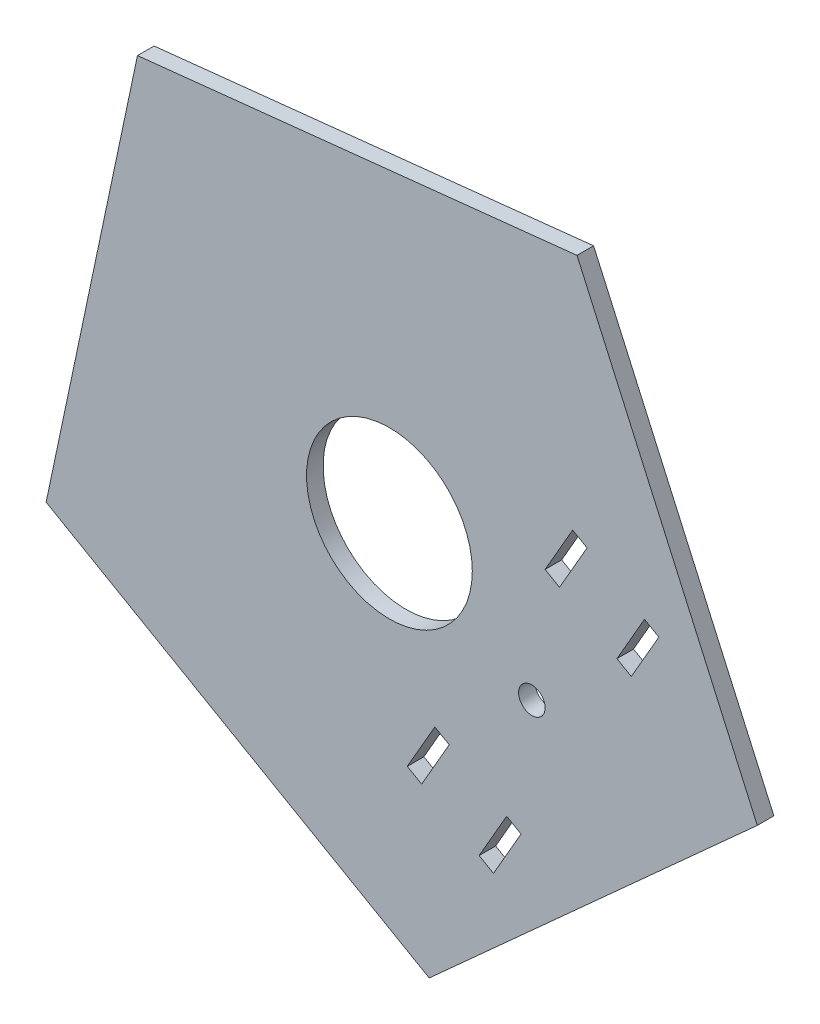
ISO-10303-21;
HEADER;
FILE_DESCRIPTION(('STEP AP214'),'2;1');
FILE_NAME('part.step','',(''),(''),'','','');
FILE_SCHEMA(('AUTOMOTIVE_DESIGN { 1 0 10303 214 1 1 1 1 }'));
ENDSEC;
DATA;
#1=APPLICATION_CONTEXT('core data for automotive mechanical design processes');
#2=APPLICATION_PROTOCOL_DEFINITION('international standard','automotive_design',2000,#1);
#3=PRODUCT_CONTEXT('',#1,'mechanical');
#4=PRODUCT('Part','Part','',(#3));
#5=PRODUCT_RELATED_PRODUCT_CATEGORY('part','',(#4));
#6=PRODUCT_DEFINITION_FORMATION('','',#4);
#7=PRODUCT_DEFINITION_CONTEXT('part definition',#1,'design');
#8=PRODUCT_DEFINITION('design','',#6,#7);
#9=PRODUCT_DEFINITION_SHAPE('','',#8);
#10=(LENGTH_UNIT() NAMED_UNIT(*) SI_UNIT(.MILLI.,.METRE.));
#11=(NAMED_UNIT(*) PLANE_ANGLE_UNIT() SI_UNIT($,.RADIAN.));
#12=(NAMED_UNIT(*) SI_UNIT($,.STERADIAN.) SOLID_ANGLE_UNIT());
#13=UNCERTAINTY_MEASURE_WITH_UNIT(LENGTH_MEASURE(1.E-05),#10,'distance_accuracy_value','');
#14=(GEOMETRIC_REPRESENTATION_CONTEXT(3) GLOBAL_UNCERTAINTY_ASSIGNED_CONTEXT((#13)) GLOBAL_UNIT_ASSIGNED_CONTEXT((#10,
#11,#12)) REPRESENTATION_CONTEXT('',''));
#15=CARTESIAN_POINT('',(0.,0.,0.));
#16=DIRECTION('',(0.,0.,1.));
#17=DIRECTION('',(1.,0.,0.));
#18=AXIS2_PLACEMENT_3D('',#15,#16,#17);
#19=CARTESIAN_POINT('',(0.,0.,3.));
#20=DIRECTION('',(0.,0.,1.));
#21=DIRECTION('',(1.,0.,0.));
#22=AXIS2_PLACEMENT_3D('',#19,#20,#21);
#23=PLANE('',#22);
#24=CARTESIAN_POINT('',(25.7831269704512,-14.8422661216403,3.));
#25=DIRECTION('',(0.,0.,-1.));
#26=DIRECTION('',(-1.,0.,0.));
#27=AXIS2_PLACEMENT_3D('',#24,#25,#26);
#28=CIRCLE('',#27,2.4);
#29=CARTESIAN_POINT('',(23.3831269704512,-14.8422661216403,3.));
#30=VERTEX_POINT('',#29);
#31=EDGE_CURVE('E602',#30,#30,#28,.T.);
#32=ORIENTED_EDGE('',*,*,#31,.T.);
#33=EDGE_LOOP('',(#32));
#34=FACE_BOUND('',#33,.T.);
#35=DIRECTION('',(-0.8666597300992,0.498899701567742,0.));
#36=VECTOR('',#35,1.);
#37=CARTESIAN_POINT('',(10.821839491026,-29.3067874396098,3.));
#38=LINE('',#37,#36);
#39=CARTESIAN_POINT('',(10.821839491026,-29.3067874396098,3.));
#40=VERTEX_POINT('',#39);
#41=CARTESIAN_POINT('',(8.22186030072837,-27.8100883349066,3.));
#42=VERTEX_POINT('',#41);
#43=EDGE_CURVE('E58',#40,#42,#38,.T.);
#44=ORIENTED_EDGE('',*,*,#43,.F.);
#45=DIRECTION('',(-0.498899701567742,-0.8666597300992,0.));
#46=VECTOR('',#45,1.);
#47=CARTESIAN_POINT('',(10.821839491026,-29.3067874396098,3.));
#48=LINE('',#47,#46);
#49=CARTESIAN_POINT('',(5.83284247534856,-37.9733847406018,3.));
#50=VERTEX_POINT('',#49);
#51=EDGE_CURVE('E254',#40,#50,#48,.T.);
#52=ORIENTED_EDGE('',*,*,#51,.T.);
#53=DIRECTION('',(-0.8666597300992,0.498899701567741,0.));
#54=VECTOR('',#53,1.);
#55=CARTESIAN_POINT('',(5.83284247534856,-37.9733847406018,3.));
#56=LINE('',#55,#54);
#57=CARTESIAN_POINT('',(3.23286328505096,-36.4766856358986,3.));
#58=VERTEX_POINT('',#57);
#59=EDGE_CURVE('E257',#50,#58,#56,.T.);
#60=ORIENTED_EDGE('',*,*,#59,.T.);
#61=DIRECTION('',(-0.498899701567741,-0.8666597300992,0.));
#62=VECTOR('',#61,1.);
#63=CARTESIAN_POINT('',(8.22186030072838,-27.8100883349066,3.));
#64=LINE('',#63,#62);
#65=EDGE_CURVE('E261',#42,#58,#64,.T.);
#66=ORIENTED_EDGE('',*,*,#65,.F.);
#67=EDGE_LOOP('',(#44,#52,#60,#66));
#68=FACE_BOUND('',#67,.T.);
#69=CARTESIAN_POINT('',(0.,0.,3.));
#70=DIRECTION('',(0.,0.,1.));
#71=DIRECTION('',(1.,0.,0.));
#72=AXIS2_PLACEMENT_3D('',#69,#70,#71);
#73=CIRCLE('',#72,15.);
#74=CARTESIAN_POINT('',(15.,0.,3.));
#75=VERTEX_POINT('',#74);
#76=EDGE_CURVE('E298',#75,#75,#73,.T.);
#77=ORIENTED_EDGE('',*,*,#76,.F.);
#78=EDGE_LOOP('',(#77));
#79=FACE_BOUND('',#78,.T.);
#80=DIRECTION('',(-0.407896563036024,0.913028145164977,0.));
#81=VECTOR('',#80,1.);
#82=CARTESIAN_POINT('',(66.5828797968972,-14.0642676151945,3.));
#83=LINE('',#82,#81);
#84=CARTESIAN_POINT('',(66.5828797968972,-14.0642676151945,3.));
#85=VERTEX_POINT('',#84);
#86=CARTESIAN_POINT('',(33.9511547540153,58.9779839980037,3.));
#87=VERTEX_POINT('',#86);
#88=EDGE_CURVE('E311',#85,#87,#83,.T.);
#89=ORIENTED_EDGE('',*,*,#88,.T.);
#90=DIRECTION('',(-0.994388336945293,-0.105791471051193,0.));
#91=VECTOR('',#90,1.);
#92=CARTESIAN_POINT('',(33.9511547540153,58.9779839980037,3.));
#93=LINE('',#92,#91);
#94=CARTESIAN_POINT('',(-45.5999122016082,50.5146663139082,3.));
#95=VERTEX_POINT('',#94);
#96=EDGE_CURVE('E314',#87,#95,#93,.T.);
#97=ORIENTED_EDGE('',*,*,#96,.T.);
#98=DIRECTION('',(-0.20666922721265,-0.978410869994465,0.));
#99=VECTOR('',#98,1.);
#100=CARTESIAN_POINT('',(-45.5999122016082,50.5146663139082,3.));
#101=LINE('',#100,#99);
#102=CARTESIAN_POINT('',(-62.1334503786201,-27.758203285649,3.));
#103=VERTEX_POINT('',#102);
#104=EDGE_CURVE('E317',#95,#103,#101,.T.);
#105=ORIENTED_EDGE('',*,*,#104,.T.);
#106=DIRECTION('',(0.8666597300992,-0.498899701567741,0.));
#107=VECTOR('',#106,1.);
#108=CARTESIAN_POINT('',(-62.1334503786201,-27.758203285649,3.));
#109=LINE('',#108,#107);
#110=CARTESIAN_POINT('',(7.19932802931592,-67.6701794110683,3.));
#111=VERTEX_POINT('',#110);
#112=EDGE_CURVE('E319',#103,#111,#109,.T.);
#113=ORIENTED_EDGE('',*,*,#112,.T.);
#114=DIRECTION('',(0.742294397094766,0.670073897448422,0.));
#115=VECTOR('',#114,1.);
#116=CARTESIAN_POINT('',(7.19932802931592,-67.6701794110683,3.));
#117=LINE('',#116,#115);
#118=EDGE_CURVE('E321',#111,#85,#117,.T.);
#119=ORIENTED_EDGE('',*,*,#118,.T.);
#120=EDGE_LOOP('',(#89,#97,#105,#113,#119));
#121=FACE_BOUND('',#120,.T.);
#122=DIRECTION('',(-0.866659730099201,0.49889970156774,0.));
#123=VECTOR('',#122,1.);
#124=CARTESIAN_POINT('',(9.97799403135477,17.333194601984,3.));
#125=LINE('',#124,#123);
#126=CARTESIAN_POINT('',(30.7778275537356,5.35960176435822,3.));
#127=VERTEX_POINT('',#126);
#128=CARTESIAN_POINT('',(28.177848363438,6.85630086906145,3.));
#129=VERTEX_POINT('',#128);
#130=EDGE_CURVE('E288',#127,#129,#125,.T.);
#131=ORIENTED_EDGE('',*,*,#130,.T.);
#132=DIRECTION('',(0.498899701567744,0.866659730099199,0.));
#133=VECTOR('',#132,1.);
#134=CARTESIAN_POINT('',(18.1998543320831,-10.4768937329226,3.));
#135=LINE('',#134,#133);
#136=CARTESIAN_POINT('',(33.1668453791155,15.5228981700534,3.));
#137=VERTEX_POINT('',#136);
#138=EDGE_CURVE('E237',#129,#137,#135,.T.);
#139=ORIENTED_EDGE('',*,*,#138,.T.);
#140=DIRECTION('',(-0.866659730099201,0.498899701567739,0.));
#141=VECTOR('',#140,1.);
#142=CARTESIAN_POINT('',(14.9669910470322,25.999791902976,3.));
#143=LINE('',#142,#141);
#144=CARTESIAN_POINT('',(35.7668245694131,14.0261990653502,3.));
#145=VERTEX_POINT('',#144);
#146=EDGE_CURVE('E277',#145,#137,#143,.T.);
#147=ORIENTED_EDGE('',*,*,#146,.F.);
#148=DIRECTION('',(0.498899701567743,0.866659730099199,0.));
#149=VECTOR('',#148,1.);
#150=CARTESIAN_POINT('',(20.7998335223807,-11.9735928376258,3.));
#151=LINE('',#150,#149);
#152=EDGE_CURVE('E291',#127,#145,#151,.T.);
#153=ORIENTED_EDGE('',*,*,#152,.F.);
#154=EDGE_LOOP('',(#131,#139,#147,#153));
#155=FACE_BOUND('',#154,.T.);
#156=DIRECTION('',(-0.498899701567742,-0.8666597300992,0.));
#157=VECTOR('',#156,1.);
#158=CARTESIAN_POINT('',(21.2217562522164,-35.2935838584227,3.));
#159=LINE('',#158,#157);
#160=CARTESIAN_POINT('',(21.2217562522164,-35.2935838584227,3.));
#161=VERTEX_POINT('',#160);
#162=CARTESIAN_POINT('',(16.232759236539,-43.9601811594147,3.));
#163=VERTEX_POINT('',#162);
#164=EDGE_CURVE('E196',#161,#163,#159,.T.);
#165=ORIENTED_EDGE('',*,*,#164,.F.);
#166=DIRECTION('',(0.8666597300992,-0.498899701567742,0.));
#167=VECTOR('',#166,1.);
#168=CARTESIAN_POINT('',(21.2217562522164,-35.2935838584227,3.));
#169=LINE('',#168,#167);
#170=CARTESIAN_POINT('',(23.821735442514,-36.7902829631259,3.));
#171=VERTEX_POINT('',#170);
#172=EDGE_CURVE('E205',#161,#171,#169,.T.);
#173=ORIENTED_EDGE('',*,*,#172,.T.);
#174=DIRECTION('',(-0.498899701567742,-0.8666597300992,0.));
#175=VECTOR('',#174,1.);
#176=CARTESIAN_POINT('',(23.821735442514,-36.7902829631259,3.));
#177=LINE('',#176,#175);
#178=CARTESIAN_POINT('',(18.8327384268366,-45.4568802641179,3.));
#179=VERTEX_POINT('',#178);
#180=EDGE_CURVE('E203',#171,#179,#177,.T.);
#181=ORIENTED_EDGE('',*,*,#180,.T.);
#182=DIRECTION('',(0.8666597300992,-0.498899701567742,0.));
#183=VECTOR('',#182,1.);
#184=CARTESIAN_POINT('',(16.232759236539,-43.9601811594147,3.));
#185=LINE('',#184,#183);
#186=EDGE_CURVE('E184',#163,#179,#185,.T.);
#187=ORIENTED_EDGE('',*,*,#186,.F.);
#188=EDGE_LOOP('',(#165,#173,#181,#187));
#189=FACE_BOUND('',#188,.T.);
#190=DIRECTION('',(0.866659730099199,-0.498899701567744,0.));
#191=VECTOR('',#190,1.);
#192=CARTESIAN_POINT('',(9.97799403135491,17.3331946019841,3.));
#193=LINE('',#192,#191);
#194=CARTESIAN_POINT('',(41.1777443149261,-0.6271946544547,3.));
#195=VERTEX_POINT('',#194);
#196=CARTESIAN_POINT('',(43.7777235052237,-2.12389375915793,3.));
#197=VERTEX_POINT('',#196);
#198=EDGE_CURVE('E233',#195,#197,#193,.T.);
#199=ORIENTED_EDGE('',*,*,#198,.F.);
#200=DIRECTION('',(0.49889970156774,0.866659730099201,0.));
#201=VECTOR('',#200,1.);
#202=CARTESIAN_POINT('',(31.1997502835713,-17.9603892564387,3.));
#203=LINE('',#202,#201);
#204=CARTESIAN_POINT('',(46.1667413306035,8.03940264653732,3.));
#205=VERTEX_POINT('',#204);
#206=EDGE_CURVE('E50',#195,#205,#203,.T.);
#207=ORIENTED_EDGE('',*,*,#206,.T.);
#208=DIRECTION('',(0.866659730099199,-0.498899701567743,0.));
#209=VECTOR('',#208,1.);
#210=CARTESIAN_POINT('',(14.9669910470323,25.999791902976,3.));
#211=LINE('',#210,#209);
#212=CARTESIAN_POINT('',(48.7667205209011,6.54270354183408,3.));
#213=VERTEX_POINT('',#212);
#214=EDGE_CURVE('E226',#205,#213,#211,.T.);
#215=ORIENTED_EDGE('',*,*,#214,.T.);
#216=DIRECTION('',(0.49889970156774,0.866659730099201,0.));
#217=VECTOR('',#216,1.);
#218=CARTESIAN_POINT('',(33.7997294738689,-19.4570883611419,3.));
#219=LINE('',#218,#217);
#220=EDGE_CURVE('E229',#197,#213,#219,.T.);
#221=ORIENTED_EDGE('',*,*,#220,.F.);
#222=EDGE_LOOP('',(#199,#207,#215,#221));
#223=FACE_BOUND('',#222,.T.);
#224=ADVANCED_FACE('F35',(#34,#68,#79,#121,#155,#189,#223),#23,.T.);
#225=CARTESIAN_POINT('',(0.,0.,0.));
#226=DIRECTION('',(0.,0.,1.));
#227=DIRECTION('',(1.,0.,0.));
#228=AXIS2_PLACEMENT_3D('',#225,#226,#227);
#229=PLANE('',#228);
#230=CARTESIAN_POINT('',(25.7831269704512,-14.8422661216403,0.));
#231=DIRECTION('',(0.,0.,-1.));
#232=DIRECTION('',(-1.,0.,0.));
#233=AXIS2_PLACEMENT_3D('',#230,#231,#232);
#234=CIRCLE('',#233,2.4);
#235=CARTESIAN_POINT('',(23.3831269704512,-14.8422661216403,0.));
#236=VERTEX_POINT('',#235);
#237=EDGE_CURVE('E605',#236,#236,#234,.T.);
#238=ORIENTED_EDGE('',*,*,#237,.F.);
#239=EDGE_LOOP('',(#238));
#240=FACE_BOUND('',#239,.T.);
#241=DIRECTION('',(0.8666597300992,-0.498899701567742,0.));
#242=VECTOR('',#241,1.);
#243=CARTESIAN_POINT('',(21.2217562522164,-35.2935838584227,0.));
#244=LINE('',#243,#242);
#245=CARTESIAN_POINT('',(21.2217562522164,-35.2935838584227,0.));
#246=VERTEX_POINT('',#245);
#247=CARTESIAN_POINT('',(23.821735442514,-36.7902829631259,0.));
#248=VERTEX_POINT('',#247);
#249=EDGE_CURVE('E200',#246,#248,#244,.T.);
#250=ORIENTED_EDGE('',*,*,#249,.F.);
#251=DIRECTION('',(-0.498899701567742,-0.8666597300992,0.));
#252=VECTOR('',#251,1.);
#253=CARTESIAN_POINT('',(21.2217562522164,-35.2935838584227,0.));
#254=LINE('',#253,#252);
#255=CARTESIAN_POINT('',(16.232759236539,-43.9601811594147,0.));
#256=VERTEX_POINT('',#255);
#257=EDGE_CURVE('E211',#246,#256,#254,.T.);
#258=ORIENTED_EDGE('',*,*,#257,.T.);
#259=DIRECTION('',(0.8666597300992,-0.498899701567742,0.));
#260=VECTOR('',#259,1.);
#261=CARTESIAN_POINT('',(16.232759236539,-43.9601811594147,0.));
#262=LINE('',#261,#260);
#263=CARTESIAN_POINT('',(18.8327384268366,-45.4568802641179,0.));
#264=VERTEX_POINT('',#263);
#265=EDGE_CURVE('E187',#256,#264,#262,.T.);
#266=ORIENTED_EDGE('',*,*,#265,.T.);
#267=DIRECTION('',(-0.498899701567742,-0.8666597300992,0.));
#268=VECTOR('',#267,1.);
#269=CARTESIAN_POINT('',(23.821735442514,-36.7902829631259,0.));
#270=LINE('',#269,#268);
#271=EDGE_CURVE('E214',#248,#264,#270,.T.);
#272=ORIENTED_EDGE('',*,*,#271,.F.);
#273=EDGE_LOOP('',(#250,#258,#266,#272));
#274=FACE_BOUND('',#273,.T.);
#275=DIRECTION('',(-0.407896563036024,0.913028145164977,0.));
#276=VECTOR('',#275,1.);
#277=CARTESIAN_POINT('',(66.5828797968972,-14.0642676151945,0.));
#278=LINE('',#277,#276);
#279=CARTESIAN_POINT('',(66.5828797968972,-14.0642676151945,0.));
#280=VERTEX_POINT('',#279);
#281=CARTESIAN_POINT('',(33.9511547540153,58.9779839980037,0.));
#282=VERTEX_POINT('',#281);
#283=EDGE_CURVE('E308',#280,#282,#278,.T.);
#284=ORIENTED_EDGE('',*,*,#283,.F.);
#285=DIRECTION('',(0.742294397094766,0.670073897448422,0.));
#286=VECTOR('',#285,1.);
#287=CARTESIAN_POINT('',(7.19932802931592,-67.6701794110683,0.));
#288=LINE('',#287,#286);
#289=CARTESIAN_POINT('',(7.19932802931592,-67.6701794110683,0.));
#290=VERTEX_POINT('',#289);
#291=EDGE_CURVE('E315',#290,#280,#288,.T.);
#292=ORIENTED_EDGE('',*,*,#291,.F.);
#293=DIRECTION('',(0.8666597300992,-0.498899701567741,0.));
#294=VECTOR('',#293,1.);
#295=CARTESIAN_POINT('',(-62.1334503786201,-27.758203285649,0.));
#296=LINE('',#295,#294);
#297=CARTESIAN_POINT('',(-62.1334503786201,-27.758203285649,0.));
#298=VERTEX_POINT('',#297);
#299=EDGE_CURVE('E330',#298,#290,#296,.T.);
#300=ORIENTED_EDGE('',*,*,#299,.F.);
#301=DIRECTION('',(-0.20666922721265,-0.978410869994465,0.));
#302=VECTOR('',#301,1.);
#303=CARTESIAN_POINT('',(-45.5999122016082,50.5146663139082,0.));
#304=LINE('',#303,#302);
#305=CARTESIAN_POINT('',(-45.5999122016082,50.5146663139082,0.));
#306=VERTEX_POINT('',#305);
#307=EDGE_CURVE('E328',#306,#298,#304,.T.);
#308=ORIENTED_EDGE('',*,*,#307,.F.);
#309=DIRECTION('',(-0.994388336945293,-0.105791471051193,0.));
#310=VECTOR('',#309,1.);
#311=CARTESIAN_POINT('',(33.9511547540153,58.9779839980037,0.));
#312=LINE('',#311,#310);
#313=EDGE_CURVE('E326',#282,#306,#312,.T.);
#314=ORIENTED_EDGE('',*,*,#313,.F.);
#315=EDGE_LOOP('',(#284,#292,#300,#308,#314));
#316=FACE_BOUND('',#315,.T.);
#317=CARTESIAN_POINT('',(0.,0.,0.));
#318=DIRECTION('',(0.,0.,1.));
#319=DIRECTION('',(1.,0.,0.));
#320=AXIS2_PLACEMENT_3D('',#317,#318,#319);
#321=CIRCLE('',#320,15.);
#322=CARTESIAN_POINT('',(15.,0.,0.));
#323=VERTEX_POINT('',#322);
#324=EDGE_CURVE('E305',#323,#323,#321,.T.);
#325=ORIENTED_EDGE('',*,*,#324,.T.);
#326=EDGE_LOOP('',(#325));
#327=FACE_BOUND('',#326,.T.);
#328=DIRECTION('',(0.498899701567744,0.866659730099199,0.));
#329=VECTOR('',#328,1.);
#330=CARTESIAN_POINT('',(18.1998543320831,-10.4768937329226,0.));
#331=LINE('',#330,#329);
#332=CARTESIAN_POINT('',(28.177848363438,6.85630086906145,0.));
#333=VERTEX_POINT('',#332);
#334=CARTESIAN_POINT('',(33.1668453791155,15.5228981700534,0.));
#335=VERTEX_POINT('',#334);
#336=EDGE_CURVE('E274',#333,#335,#331,.T.);
#337=ORIENTED_EDGE('',*,*,#336,.F.);
#338=DIRECTION('',(-0.866659730099201,0.49889970156774,0.));
#339=VECTOR('',#338,1.);
#340=CARTESIAN_POINT('',(9.97799403135477,17.333194601984,0.));
#341=LINE('',#340,#339);
#342=CARTESIAN_POINT('',(30.7778275537356,5.35960176435823,0.));
#343=VERTEX_POINT('',#342);
#344=EDGE_CURVE('E276',#343,#333,#341,.T.);
#345=ORIENTED_EDGE('',*,*,#344,.F.);
#346=DIRECTION('',(0.498899701567743,0.866659730099199,0.));
#347=VECTOR('',#346,1.);
#348=CARTESIAN_POINT('',(20.7998335223807,-11.9735928376258,0.));
#349=LINE('',#348,#347);
#350=CARTESIAN_POINT('',(35.7668245694131,14.0261990653502,0.));
#351=VERTEX_POINT('',#350);
#352=EDGE_CURVE('E279',#343,#351,#349,.T.);
#353=ORIENTED_EDGE('',*,*,#352,.T.);
#354=DIRECTION('',(-0.866659730099201,0.498899701567739,0.));
#355=VECTOR('',#354,1.);
#356=CARTESIAN_POINT('',(14.9669910470322,25.999791902976,0.));
#357=LINE('',#356,#355);
#358=EDGE_CURVE('E282',#351,#335,#357,.T.);
#359=ORIENTED_EDGE('',*,*,#358,.T.);
#360=EDGE_LOOP('',(#337,#345,#353,#359));
#361=FACE_BOUND('',#360,.T.);
#362=DIRECTION('',(-0.498899701567742,-0.8666597300992,0.));
#363=VECTOR('',#362,1.);
#364=CARTESIAN_POINT('',(10.821839491026,-29.3067874396098,0.));
#365=LINE('',#364,#363);
#366=CARTESIAN_POINT('',(10.821839491026,-29.3067874396098,0.));
#367=VERTEX_POINT('',#366);
#368=CARTESIAN_POINT('',(5.83284247534856,-37.9733847406018,0.));
#369=VERTEX_POINT('',#368);
#370=EDGE_CURVE('E248',#367,#369,#365,.T.);
#371=ORIENTED_EDGE('',*,*,#370,.F.);
#372=DIRECTION('',(-0.8666597300992,0.498899701567742,0.));
#373=VECTOR('',#372,1.);
#374=CARTESIAN_POINT('',(10.821839491026,-29.3067874396098,0.));
#375=LINE('',#374,#373);
#376=CARTESIAN_POINT('',(8.22186030072838,-27.8100883349066,0.));
#377=VERTEX_POINT('',#376);
#378=EDGE_CURVE('E258',#367,#377,#375,.T.);
#379=ORIENTED_EDGE('',*,*,#378,.T.);
#380=DIRECTION('',(-0.498899701567741,-0.8666597300992,0.));
#381=VECTOR('',#380,1.);
#382=CARTESIAN_POINT('',(8.22186030072838,-27.8100883349066,0.));
#383=LINE('',#382,#381);
#384=CARTESIAN_POINT('',(3.23286328505096,-36.4766856358986,0.));
#385=VERTEX_POINT('',#384);
#386=EDGE_CURVE('E269',#377,#385,#383,.T.);
#387=ORIENTED_EDGE('',*,*,#386,.T.);
#388=DIRECTION('',(-0.8666597300992,0.498899701567741,0.));
#389=VECTOR('',#388,1.);
#390=CARTESIAN_POINT('',(5.83284247534856,-37.9733847406018,0.));
#391=LINE('',#390,#389);
#392=EDGE_CURVE('E266',#369,#385,#391,.T.);
#393=ORIENTED_EDGE('',*,*,#392,.F.);
#394=EDGE_LOOP('',(#371,#379,#387,#393));
#395=FACE_BOUND('',#394,.T.);
#396=DIRECTION('',(0.49889970156774,0.866659730099201,0.));
#397=VECTOR('',#396,1.);
#398=CARTESIAN_POINT('',(31.1997502835713,-17.9603892564387,0.));
#399=LINE('',#398,#397);
#400=CARTESIAN_POINT('',(41.1777443149261,-0.627194654454696,0.));
#401=VERTEX_POINT('',#400);
#402=CARTESIAN_POINT('',(46.1667413306035,8.03940264653732,0.));
#403=VERTEX_POINT('',#402);
#404=EDGE_CURVE('E230',#401,#403,#399,.T.);
#405=ORIENTED_EDGE('',*,*,#404,.F.);
#406=DIRECTION('',(0.866659730099199,-0.498899701567744,0.));
#407=VECTOR('',#406,1.);
#408=CARTESIAN_POINT('',(9.97799403135491,17.3331946019841,0.));
#409=LINE('',#408,#407);
#410=CARTESIAN_POINT('',(43.7777235052237,-2.12389375915793,0.));
#411=VERTEX_POINT('',#410);
#412=EDGE_CURVE('E242',#401,#411,#409,.T.);
#413=ORIENTED_EDGE('',*,*,#412,.T.);
#414=DIRECTION('',(0.49889970156774,0.866659730099201,0.));
#415=VECTOR('',#414,1.);
#416=CARTESIAN_POINT('',(33.7997294738689,-19.4570883611419,0.));
#417=LINE('',#416,#415);
#418=CARTESIAN_POINT('',(48.7667205209011,6.54270354183408,0.));
#419=VERTEX_POINT('',#418);
#420=EDGE_CURVE('E239',#411,#419,#417,.T.);
#421=ORIENTED_EDGE('',*,*,#420,.T.);
#422=DIRECTION('',(0.866659730099199,-0.498899701567743,0.));
#423=VECTOR('',#422,1.);
#424=CARTESIAN_POINT('',(14.9669910470323,25.999791902976,0.));
#425=LINE('',#424,#423);
#426=EDGE_CURVE('E219',#403,#419,#425,.T.);
#427=ORIENTED_EDGE('',*,*,#426,.F.);
#428=EDGE_LOOP('',(#405,#413,#421,#427));
#429=FACE_BOUND('',#428,.T.);
#430=ADVANCED_FACE('F351',(#240,#274,#316,#327,#361,#395,#429),#229,.F.);
#431=CARTESIAN_POINT('',(66.5828797968972,-14.0642676151945,3.));
#432=DIRECTION('',(-0.913028145164977,-0.407896563036024,0.));
#433=DIRECTION('',(0.407896563036024,-0.913028145164977,0.));
#434=AXIS2_PLACEMENT_3D('',#431,#432,#433);
#435=PLANE('',#434);
#436=ORIENTED_EDGE('',*,*,#283,.T.);
#437=DIRECTION('',(0.,0.,-1.));
#438=VECTOR('',#437,1.);
#439=CARTESIAN_POINT('',(33.9511547540153,58.9779839980037,3.));
#440=LINE('',#439,#438);
#441=EDGE_CURVE('E11',#87,#282,#440,.T.);
#442=ORIENTED_EDGE('',*,*,#441,.F.);
#443=ORIENTED_EDGE('',*,*,#88,.F.);
#444=DIRECTION('',(0.,0.,-1.));
#445=VECTOR('',#444,1.);
#446=CARTESIAN_POINT('',(66.5828797968972,-14.0642676151945,3.));
#447=LINE('',#446,#445);
#448=EDGE_CURVE('E323',#85,#280,#447,.T.);
#449=ORIENTED_EDGE('',*,*,#448,.T.);
#450=EDGE_LOOP('',(#436,#442,#443,#449));
#451=FACE_BOUND('',#450,.T.);
#452=ADVANCED_FACE('F37',(#451),#435,.F.);
#453=CARTESIAN_POINT('',(33.9511547540153,58.9779839980037,3.));
#454=DIRECTION('',(0.105791471051193,-0.994388336945292,0.));
#455=DIRECTION('',(0.994388336945292,0.105791471051193,0.));
#456=AXIS2_PLACEMENT_3D('',#453,#454,#455);
#457=PLANE('',#456);
#458=ORIENTED_EDGE('',*,*,#313,.T.);
#459=DIRECTION('',(0.,0.,-1.));
#460=VECTOR('',#459,1.);
#461=CARTESIAN_POINT('',(-45.5999122016082,50.5146663139082,3.));
#462=LINE('',#461,#460);
#463=EDGE_CURVE('E43',#95,#306,#462,.T.);
#464=ORIENTED_EDGE('',*,*,#463,.F.);
#465=ORIENTED_EDGE('',*,*,#96,.F.);
#466=ORIENTED_EDGE('',*,*,#441,.T.);
#467=EDGE_LOOP('',(#458,#464,#465,#466));
#468=FACE_BOUND('',#467,.T.);
#469=ADVANCED_FACE('F366',(#468),#457,.F.);
#470=CARTESIAN_POINT('',(-45.5999122016082,50.5146663139082,3.));
#471=DIRECTION('',(0.978410869994465,-0.206669227212649,0.));
#472=DIRECTION('',(0.20666922721265,0.978410869994465,0.));
#473=AXIS2_PLACEMENT_3D('',#470,#471,#472);
#474=PLANE('',#473);
#475=ORIENTED_EDGE('',*,*,#307,.T.);
#476=DIRECTION('',(0.,0.,-1.));
#477=VECTOR('',#476,1.);
#478=CARTESIAN_POINT('',(-62.1334503786201,-27.758203285649,3.));
#479=LINE('',#478,#477);
#480=EDGE_CURVE('E338',#103,#298,#479,.T.);
#481=ORIENTED_EDGE('',*,*,#480,.F.);
#482=ORIENTED_EDGE('',*,*,#104,.F.);
#483=ORIENTED_EDGE('',*,*,#463,.T.);
#484=EDGE_LOOP('',(#475,#481,#482,#483));
#485=FACE_BOUND('',#484,.T.);
#486=ADVANCED_FACE('F345',(#485),#474,.F.);
#487=CARTESIAN_POINT('',(-62.1334503786201,-27.758203285649,3.));
#488=DIRECTION('',(0.498899701567741,0.8666597300992,0.));
#489=DIRECTION('',(-0.8666597300992,0.498899701567741,0.));
#490=AXIS2_PLACEMENT_3D('',#487,#488,#489);
#491=PLANE('',#490);
#492=ORIENTED_EDGE('',*,*,#299,.T.);
#493=DIRECTION('',(0.,0.,-1.));
#494=VECTOR('',#493,1.);
#495=CARTESIAN_POINT('',(7.19932802931592,-67.6701794110683,3.));
#496=LINE('',#495,#494);
#497=EDGE_CURVE('E335',#111,#290,#496,.T.);
#498=ORIENTED_EDGE('',*,*,#497,.F.);
#499=ORIENTED_EDGE('',*,*,#112,.F.);
#500=ORIENTED_EDGE('',*,*,#480,.T.);
#501=EDGE_LOOP('',(#492,#498,#499,#500));
#502=FACE_BOUND('',#501,.T.);
#503=ADVANCED_FACE('F356',(#502),#491,.F.);
#504=CARTESIAN_POINT('',(7.19932802931592,-67.6701794110683,3.));
#505=DIRECTION('',(-0.670073897448422,0.742294397094766,0.));
#506=DIRECTION('',(-0.742294397094766,-0.670073897448422,0.));
#507=AXIS2_PLACEMENT_3D('',#504,#505,#506);
#508=PLANE('',#507);
#509=ORIENTED_EDGE('',*,*,#291,.T.);
#510=ORIENTED_EDGE('',*,*,#448,.F.);
#511=ORIENTED_EDGE('',*,*,#118,.F.);
#512=ORIENTED_EDGE('',*,*,#497,.T.);
#513=EDGE_LOOP('',(#509,#510,#511,#512));
#514=FACE_BOUND('',#513,.T.);
#515=ADVANCED_FACE('F360',(#514),#508,.F.);
#516=CARTESIAN_POINT('',(0.,0.,0.));
#517=DIRECTION('',(0.,0.,1.));
#518=DIRECTION('',(1.,0.,0.));
#519=AXIS2_PLACEMENT_3D('',#516,#517,#518);
#520=CYLINDRICAL_SURFACE('',#519,15.);
#521=ORIENTED_EDGE('',*,*,#324,.F.);
#522=EDGE_LOOP('',(#521));
#523=FACE_BOUND('',#522,.T.);
#524=ORIENTED_EDGE('',*,*,#76,.T.);
#525=EDGE_LOOP('',(#524));
#526=FACE_BOUND('',#525,.T.);
#527=ADVANCED_FACE('F385',(#523,#526),#520,.F.);
#528=CARTESIAN_POINT('',(18.1998543320831,-10.4768937329226,0.));
#529=DIRECTION('',(0.866659730099199,-0.498899701567744,0.));
#530=DIRECTION('',(0.498899701567744,0.866659730099199,0.));
#531=AXIS2_PLACEMENT_3D('',#528,#529,#530);
#532=PLANE('',#531);
#533=ORIENTED_EDGE('',*,*,#138,.F.);
#534=DIRECTION('',(0.,0.,1.));
#535=VECTOR('',#534,1.);
#536=CARTESIAN_POINT('',(28.177848363438,6.85630086906145,0.));
#537=LINE('',#536,#535);
#538=EDGE_CURVE('E285',#333,#129,#537,.T.);
#539=ORIENTED_EDGE('',*,*,#538,.F.);
#540=ORIENTED_EDGE('',*,*,#336,.T.);
#541=DIRECTION('',(0.,0.,1.));
#542=VECTOR('',#541,1.);
#543=CARTESIAN_POINT('',(33.1668453791155,15.5228981700534,0.));
#544=LINE('',#543,#542);
#545=EDGE_CURVE('E296',#335,#137,#544,.T.);
#546=ORIENTED_EDGE('',*,*,#545,.T.);
#547=EDGE_LOOP('',(#533,#539,#540,#546));
#548=FACE_BOUND('',#547,.T.);
#549=ADVANCED_FACE('F411',(#548),#532,.T.);
#550=CARTESIAN_POINT('',(14.9669910470322,25.999791902976,0.));
#551=DIRECTION('',(0.498899701567739,0.866659730099201,0.));
#552=DIRECTION('',(-0.866659730099202,0.498899701567739,0.));
#553=AXIS2_PLACEMENT_3D('',#550,#551,#552);
#554=PLANE('',#553);
#555=ORIENTED_EDGE('',*,*,#146,.T.);
#556=ORIENTED_EDGE('',*,*,#545,.F.);
#557=ORIENTED_EDGE('',*,*,#358,.F.);
#558=DIRECTION('',(0.,0.,1.));
#559=VECTOR('',#558,1.);
#560=CARTESIAN_POINT('',(35.7668245694131,14.0261990653502,0.));
#561=LINE('',#560,#559);
#562=EDGE_CURVE('E299',#351,#145,#561,.T.);
#563=ORIENTED_EDGE('',*,*,#562,.T.);
#564=EDGE_LOOP('',(#555,#556,#557,#563));
#565=FACE_BOUND('',#564,.T.);
#566=ADVANCED_FACE('F418',(#565),#554,.F.);
#567=CARTESIAN_POINT('',(20.7998335223807,-11.9735928376258,0.));
#568=DIRECTION('',(0.866659730099199,-0.498899701567743,0.));
#569=DIRECTION('',(0.498899701567743,0.866659730099199,0.));
#570=AXIS2_PLACEMENT_3D('',#567,#568,#569);
#571=PLANE('',#570);
#572=ORIENTED_EDGE('',*,*,#152,.T.);
#573=ORIENTED_EDGE('',*,*,#562,.F.);
#574=ORIENTED_EDGE('',*,*,#352,.F.);
#575=DIRECTION('',(0.,0.,1.));
#576=VECTOR('',#575,1.);
#577=CARTESIAN_POINT('',(30.7778275537356,5.35960176435822,0.));
#578=LINE('',#577,#576);
#579=EDGE_CURVE('E301',#343,#127,#578,.T.);
#580=ORIENTED_EDGE('',*,*,#579,.T.);
#581=EDGE_LOOP('',(#572,#573,#574,#580));
#582=FACE_BOUND('',#581,.T.);
#583=ADVANCED_FACE('F425',(#582),#571,.F.);
#584=CARTESIAN_POINT('',(9.97799403135477,17.333194601984,0.));
#585=DIRECTION('',(0.49889970156774,0.866659730099201,0.));
#586=DIRECTION('',(-0.866659730099201,0.49889970156774,0.));
#587=AXIS2_PLACEMENT_3D('',#584,#585,#586);
#588=PLANE('',#587);
#589=ORIENTED_EDGE('',*,*,#130,.F.);
#590=ORIENTED_EDGE('',*,*,#579,.F.);
#591=ORIENTED_EDGE('',*,*,#344,.T.);
#592=ORIENTED_EDGE('',*,*,#538,.T.);
#593=EDGE_LOOP('',(#589,#590,#591,#592));
#594=FACE_BOUND('',#593,.T.);
#595=ADVANCED_FACE('F433',(#594),#588,.T.);
#596=CARTESIAN_POINT('',(21.2217562522164,-35.2935838584227,0.));
#597=DIRECTION('',(-0.498899701567742,-0.8666597300992,0.));
#598=DIRECTION('',(0.8666597300992,-0.498899701567742,0.));
#599=AXIS2_PLACEMENT_3D('',#596,#597,#598);
#600=PLANE('',#599);
#601=ORIENTED_EDGE('',*,*,#172,.F.);
#602=DIRECTION('',(0.,0.,1.));
#603=VECTOR('',#602,1.);
#604=CARTESIAN_POINT('',(21.2217562522164,-35.2935838584227,0.));
#605=LINE('',#604,#603);
#606=EDGE_CURVE('E191',#246,#161,#605,.T.);
#607=ORIENTED_EDGE('',*,*,#606,.F.);
#608=ORIENTED_EDGE('',*,*,#249,.T.);
#609=DIRECTION('',(0.,0.,1.));
#610=VECTOR('',#609,1.);
#611=CARTESIAN_POINT('',(23.821735442514,-36.7902829631259,0.));
#612=LINE('',#611,#610);
#613=EDGE_CURVE('E607',#248,#171,#612,.T.);
#614=ORIENTED_EDGE('',*,*,#613,.T.);
#615=EDGE_LOOP('',(#601,#607,#608,#614));
#616=FACE_BOUND('',#615,.T.);
#617=ADVANCED_FACE('F441',(#616),#600,.T.);
#618=CARTESIAN_POINT('',(23.821735442514,-36.7902829631259,0.));
#619=DIRECTION('',(-0.8666597300992,0.498899701567742,0.));
#620=DIRECTION('',(-0.498899701567742,-0.8666597300992,0.));
#621=AXIS2_PLACEMENT_3D('',#618,#619,#620);
#622=PLANE('',#621);
#623=ORIENTED_EDGE('',*,*,#180,.F.);
#624=ORIENTED_EDGE('',*,*,#613,.F.);
#625=ORIENTED_EDGE('',*,*,#271,.T.);
#626=DIRECTION('',(0.,0.,1.));
#627=VECTOR('',#626,1.);
#628=CARTESIAN_POINT('',(18.8327384268366,-45.4568802641179,0.));
#629=LINE('',#628,#627);
#630=EDGE_CURVE('E192',#264,#179,#629,.T.);
#631=ORIENTED_EDGE('',*,*,#630,.T.);
#632=EDGE_LOOP('',(#623,#624,#625,#631));
#633=FACE_BOUND('',#632,.T.);
#634=ADVANCED_FACE('F449',(#633),#622,.T.);
#635=CARTESIAN_POINT('',(16.232759236539,-43.9601811594147,0.));
#636=DIRECTION('',(-0.498899701567742,-0.8666597300992,0.));
#637=DIRECTION('',(0.8666597300992,-0.498899701567742,0.));
#638=AXIS2_PLACEMENT_3D('',#635,#636,#637);
#639=PLANE('',#638);
#640=ORIENTED_EDGE('',*,*,#186,.T.);
#641=ORIENTED_EDGE('',*,*,#630,.F.);
#642=ORIENTED_EDGE('',*,*,#265,.F.);
#643=DIRECTION('',(0.,0.,1.));
#644=VECTOR('',#643,1.);
#645=CARTESIAN_POINT('',(16.232759236539,-43.9601811594147,0.));
#646=LINE('',#645,#644);
#647=EDGE_CURVE('E179',#256,#163,#646,.T.);
#648=ORIENTED_EDGE('',*,*,#647,.T.);
#649=EDGE_LOOP('',(#640,#641,#642,#648));
#650=FACE_BOUND('',#649,.T.);
#651=ADVANCED_FACE('F181',(#650),#639,.F.);
#652=CARTESIAN_POINT('',(21.2217562522164,-35.2935838584227,0.));
#653=DIRECTION('',(-0.8666597300992,0.498899701567742,0.));
#654=DIRECTION('',(-0.498899701567742,-0.8666597300992,0.));
#655=AXIS2_PLACEMENT_3D('',#652,#653,#654);
#656=PLANE('',#655);
#657=ORIENTED_EDGE('',*,*,#164,.T.);
#658=ORIENTED_EDGE('',*,*,#647,.F.);
#659=ORIENTED_EDGE('',*,*,#257,.F.);
#660=ORIENTED_EDGE('',*,*,#606,.T.);
#661=EDGE_LOOP('',(#657,#658,#659,#660));
#662=FACE_BOUND('',#661,.T.);
#663=ADVANCED_FACE('F197',(#662),#656,.F.);
#664=CARTESIAN_POINT('',(10.821839491026,-29.3067874396098,0.));
#665=DIRECTION('',(0.498899701567742,0.8666597300992,0.));
#666=DIRECTION('',(-0.8666597300992,0.498899701567742,0.));
#667=AXIS2_PLACEMENT_3D('',#664,#665,#666);
#668=PLANE('',#667);
#669=ORIENTED_EDGE('',*,*,#43,.T.);
#670=DIRECTION('',(0.,0.,1.));
#671=VECTOR('',#670,1.);
#672=CARTESIAN_POINT('',(8.22186030072838,-27.8100883349066,0.));
#673=LINE('',#672,#671);
#674=EDGE_CURVE('E246',#377,#42,#673,.T.);
#675=ORIENTED_EDGE('',*,*,#674,.F.);
#676=ORIENTED_EDGE('',*,*,#378,.F.);
#677=DIRECTION('',(0.,0.,1.));
#678=VECTOR('',#677,1.);
#679=CARTESIAN_POINT('',(10.821839491026,-29.3067874396098,0.));
#680=LINE('',#679,#678);
#681=EDGE_CURVE('E210',#367,#40,#680,.T.);
#682=ORIENTED_EDGE('',*,*,#681,.T.);
#683=EDGE_LOOP('',(#669,#675,#676,#682));
#684=FACE_BOUND('',#683,.T.);
#685=ADVANCED_FACE('F470',(#684),#668,.F.);
#686=CARTESIAN_POINT('',(10.821839491026,-29.3067874396098,0.));
#687=DIRECTION('',(-0.8666597300992,0.498899701567742,0.));
#688=DIRECTION('',(-0.498899701567742,-0.8666597300992,0.));
#689=AXIS2_PLACEMENT_3D('',#686,#687,#688);
#690=PLANE('',#689);
#691=ORIENTED_EDGE('',*,*,#51,.F.);
#692=ORIENTED_EDGE('',*,*,#681,.F.);
#693=ORIENTED_EDGE('',*,*,#370,.T.);
#694=DIRECTION('',(0.,0.,1.));
#695=VECTOR('',#694,1.);
#696=CARTESIAN_POINT('',(5.83284247534856,-37.9733847406018,0.));
#697=LINE('',#696,#695);
#698=EDGE_CURVE('E251',#369,#50,#697,.T.);
#699=ORIENTED_EDGE('',*,*,#698,.T.);
#700=EDGE_LOOP('',(#691,#692,#693,#699));
#701=FACE_BOUND('',#700,.T.);
#702=ADVANCED_FACE('F477',(#701),#690,.T.);
#703=CARTESIAN_POINT('',(5.83284247534856,-37.9733847406018,0.));
#704=DIRECTION('',(0.498899701567741,0.8666597300992,0.));
#705=DIRECTION('',(-0.8666597300992,0.498899701567741,0.));
#706=AXIS2_PLACEMENT_3D('',#703,#704,#705);
#707=PLANE('',#706);
#708=ORIENTED_EDGE('',*,*,#59,.F.);
#709=ORIENTED_EDGE('',*,*,#698,.F.);
#710=ORIENTED_EDGE('',*,*,#392,.T.);
#711=DIRECTION('',(0.,0.,1.));
#712=VECTOR('',#711,1.);
#713=CARTESIAN_POINT('',(3.23286328505096,-36.4766856358986,0.));
#714=LINE('',#713,#712);
#715=EDGE_CURVE('E249',#385,#58,#714,.T.);
#716=ORIENTED_EDGE('',*,*,#715,.T.);
#717=EDGE_LOOP('',(#708,#709,#710,#716));
#718=FACE_BOUND('',#717,.T.);
#719=ADVANCED_FACE('F484',(#718),#707,.T.);
#720=CARTESIAN_POINT('',(8.22186030072838,-27.8100883349066,0.));
#721=DIRECTION('',(-0.8666597300992,0.498899701567741,0.));
#722=DIRECTION('',(-0.498899701567741,-0.8666597300992,0.));
#723=AXIS2_PLACEMENT_3D('',#720,#721,#722);
#724=PLANE('',#723);
#725=ORIENTED_EDGE('',*,*,#65,.T.);
#726=ORIENTED_EDGE('',*,*,#715,.F.);
#727=ORIENTED_EDGE('',*,*,#386,.F.);
#728=ORIENTED_EDGE('',*,*,#674,.T.);
#729=EDGE_LOOP('',(#725,#726,#727,#728));
#730=FACE_BOUND('',#729,.T.);
#731=ADVANCED_FACE('F492',(#730),#724,.F.);
#732=CARTESIAN_POINT('',(31.1997502835713,-17.9603892564387,0.));
#733=DIRECTION('',(0.866659730099201,-0.49889970156774,0.));
#734=DIRECTION('',(0.49889970156774,0.866659730099201,0.));
#735=AXIS2_PLACEMENT_3D('',#732,#733,#734);
#736=PLANE('',#735);
#737=ORIENTED_EDGE('',*,*,#206,.F.);
#738=DIRECTION('',(0.,0.,1.));
#739=VECTOR('',#738,1.);
#740=CARTESIAN_POINT('',(41.1777443149261,-0.627194654454696,0.));
#741=LINE('',#740,#739);
#742=EDGE_CURVE('E217',#401,#195,#741,.T.);
#743=ORIENTED_EDGE('',*,*,#742,.F.);
#744=ORIENTED_EDGE('',*,*,#404,.T.);
#745=DIRECTION('',(0.,0.,1.));
#746=VECTOR('',#745,1.);
#747=CARTESIAN_POINT('',(46.1667413306035,8.03940264653732,0.));
#748=LINE('',#747,#746);
#749=EDGE_CURVE('E224',#403,#205,#748,.T.);
#750=ORIENTED_EDGE('',*,*,#749,.T.);
#751=EDGE_LOOP('',(#737,#743,#744,#750));
#752=FACE_BOUND('',#751,.T.);
#753=ADVANCED_FACE('F500',(#752),#736,.T.);
#754=CARTESIAN_POINT('',(14.9669910470323,25.999791902976,0.));
#755=DIRECTION('',(-0.498899701567743,-0.866659730099199,0.));
#756=DIRECTION('',(0.866659730099199,-0.498899701567743,0.));
#757=AXIS2_PLACEMENT_3D('',#754,#755,#756);
#758=PLANE('',#757);
#759=ORIENTED_EDGE('',*,*,#214,.F.);
#760=ORIENTED_EDGE('',*,*,#749,.F.);
#761=ORIENTED_EDGE('',*,*,#426,.T.);
#762=DIRECTION('',(0.,0.,1.));
#763=VECTOR('',#762,1.);
#764=CARTESIAN_POINT('',(48.7667205209011,6.54270354183408,0.));
#765=LINE('',#764,#763);
#766=EDGE_CURVE('E222',#419,#213,#765,.T.);
#767=ORIENTED_EDGE('',*,*,#766,.T.);
#768=EDGE_LOOP('',(#759,#760,#761,#767));
#769=FACE_BOUND('',#768,.T.);
#770=ADVANCED_FACE('F508',(#769),#758,.T.);
#771=CARTESIAN_POINT('',(33.7997294738689,-19.4570883611419,0.));
#772=DIRECTION('',(0.866659730099201,-0.49889970156774,0.));
#773=DIRECTION('',(0.49889970156774,0.866659730099201,0.));
#774=AXIS2_PLACEMENT_3D('',#771,#772,#773);
#775=PLANE('',#774);
#776=ORIENTED_EDGE('',*,*,#220,.T.);
#777=ORIENTED_EDGE('',*,*,#766,.F.);
#778=ORIENTED_EDGE('',*,*,#420,.F.);
#779=DIRECTION('',(0.,0.,1.));
#780=VECTOR('',#779,1.);
#781=CARTESIAN_POINT('',(43.7777235052237,-2.12389375915793,0.));
#782=LINE('',#781,#780);
#783=EDGE_CURVE('E220',#411,#197,#782,.T.);
#784=ORIENTED_EDGE('',*,*,#783,.T.);
#785=EDGE_LOOP('',(#776,#777,#778,#784));
#786=FACE_BOUND('',#785,.T.);
#787=ADVANCED_FACE('F515',(#786),#775,.F.);
#788=CARTESIAN_POINT('',(9.97799403135491,17.3331946019841,0.));
#789=DIRECTION('',(-0.498899701567743,-0.866659730099199,0.));
#790=DIRECTION('',(0.866659730099199,-0.498899701567744,0.));
#791=AXIS2_PLACEMENT_3D('',#788,#789,#790);
#792=PLANE('',#791);
#793=ORIENTED_EDGE('',*,*,#198,.T.);
#794=ORIENTED_EDGE('',*,*,#783,.F.);
#795=ORIENTED_EDGE('',*,*,#412,.F.);
#796=ORIENTED_EDGE('',*,*,#742,.T.);
#797=EDGE_LOOP('',(#793,#794,#795,#796));
#798=FACE_BOUND('',#797,.T.);
#799=ADVANCED_FACE('F523',(#798),#792,.F.);
#800=CARTESIAN_POINT('',(25.7831269704512,-14.8422661216403,3.));
#801=DIRECTION('',(0.,0.,-1.));
#802=DIRECTION('',(-1.,0.,0.));
#803=AXIS2_PLACEMENT_3D('',#800,#801,#802);
#804=CYLINDRICAL_SURFACE('',#803,2.4);
#805=ORIENTED_EDGE('',*,*,#31,.F.);
#806=EDGE_LOOP('',(#805));
#807=FACE_BOUND('',#806,.T.);
#808=ORIENTED_EDGE('',*,*,#237,.T.);
#809=EDGE_LOOP('',(#808));
#810=FACE_BOUND('',#809,.T.);
#811=ADVANCED_FACE('F530',(#807,#810),#804,.F.);
#812=CLOSED_SHELL('',(#224,#430,#452,#469,#486,#503,#515,#527,#549,#566,#583,#595,#617,#634,
#651,#663,#685,#702,#719,#731,#753,#770,#787,#799,#811));
#813=MANIFOLD_SOLID_BREP('B2',#812);
#814=ADVANCED_BREP_SHAPE_REPRESENTATION('',(#18,#813),#14);
#815=SHAPE_DEFINITION_REPRESENTATION(#9,#814);
ENDSEC;
END-ISO-10303-21;
